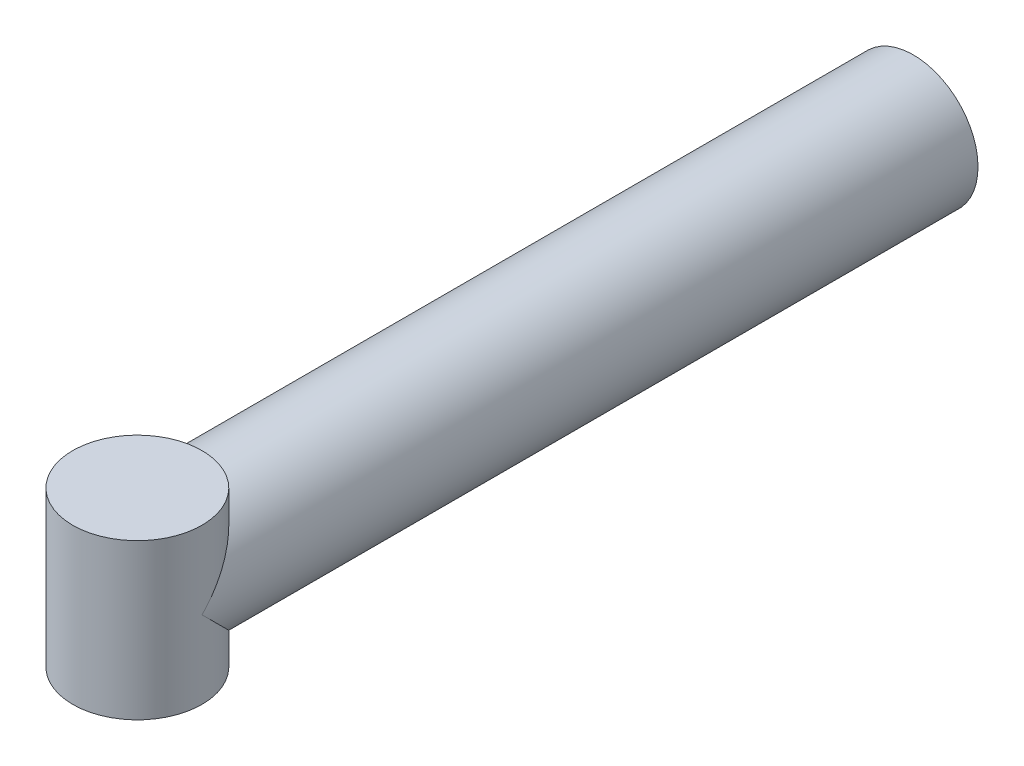
ISO-10303-21;
HEADER;
FILE_DESCRIPTION(('STEP AP214'),'2;1');
FILE_NAME('part.step','',(''),(''),'','','');
FILE_SCHEMA(('AUTOMOTIVE_DESIGN { 1 0 10303 214 1 1 1 1 }'));
ENDSEC;
DATA;
#1=APPLICATION_CONTEXT('core data for automotive mechanical design processes');
#2=APPLICATION_PROTOCOL_DEFINITION('international standard','automotive_design',2000,#1);
#3=PRODUCT_CONTEXT('',#1,'mechanical');
#4=PRODUCT('Part','Part','',(#3));
#5=PRODUCT_RELATED_PRODUCT_CATEGORY('part','',(#4));
#6=PRODUCT_DEFINITION_FORMATION('','',#4);
#7=PRODUCT_DEFINITION_CONTEXT('part definition',#1,'design');
#8=PRODUCT_DEFINITION('design','',#6,#7);
#9=PRODUCT_DEFINITION_SHAPE('','',#8);
#10=(LENGTH_UNIT() NAMED_UNIT(*) SI_UNIT(.MILLI.,.METRE.));
#11=(NAMED_UNIT(*) PLANE_ANGLE_UNIT() SI_UNIT($,.RADIAN.));
#12=(NAMED_UNIT(*) SI_UNIT($,.STERADIAN.) SOLID_ANGLE_UNIT());
#13=UNCERTAINTY_MEASURE_WITH_UNIT(LENGTH_MEASURE(1.E-05),#10,'distance_accuracy_value','');
#14=(GEOMETRIC_REPRESENTATION_CONTEXT(3) GLOBAL_UNCERTAINTY_ASSIGNED_CONTEXT((#13)) GLOBAL_UNIT_ASSIGNED_CONTEXT((#10,
#11,#12)) REPRESENTATION_CONTEXT('',''));
#15=CARTESIAN_POINT('',(0.,0.,0.));
#16=DIRECTION('',(0.,0.,1.));
#17=DIRECTION('',(1.,0.,0.));
#18=AXIS2_PLACEMENT_3D('',#15,#16,#17);
#19=CARTESIAN_POINT('',(0.,0.,75.));
#20=DIRECTION('',(0.,0.,-1.));
#21=DIRECTION('',(-1.,0.,0.));
#22=AXIS2_PLACEMENT_3D('',#19,#20,#21);
#23=CYLINDRICAL_SURFACE('',#22,6.25);
#24=CARTESIAN_POINT('',(0.,0.,0.));
#25=DIRECTION('',(0.,0.,1.));
#26=DIRECTION('',(1.,0.,0.));
#27=AXIS2_PLACEMENT_3D('',#24,#25,#26);
#28=CIRCLE('',#27,6.25);
#29=CARTESIAN_POINT('',(6.25,0.,0.));
#30=VERTEX_POINT('',#29);
#31=EDGE_CURVE('E11',#30,#30,#28,.T.);
#32=ORIENTED_EDGE('',*,*,#31,.T.);
#33=EDGE_LOOP('',(#32));
#34=FACE_BOUND('',#33,.T.);
#35=CARTESIAN_POINT('',(0.,0.,75.));
#36=DIRECTION('',(0.,-0.707106781186547,-0.707106781186547));
#37=DIRECTION('',(0.,0.707106781186547,-0.707106781186547));
#38=AXIS2_PLACEMENT_3D('',#35,#36,#37);
#39=ELLIPSE('',#38,8.83883476483185,6.25);
#40=CARTESIAN_POINT('',(6.25,0.,75.));
#41=VERTEX_POINT('',#40);
#42=CARTESIAN_POINT('',(-6.25,0.,75.));
#43=VERTEX_POINT('',#42);
#44=EDGE_CURVE('E40',#41,#43,#39,.F.);
#45=ORIENTED_EDGE('',*,*,#44,.F.);
#46=CARTESIAN_POINT('',(0.,0.,75.));
#47=DIRECTION('',(0.,0.707106781186547,-0.707106781186547));
#48=DIRECTION('',(0.,-0.707106781186547,-0.707106781186547));
#49=AXIS2_PLACEMENT_3D('',#46,#47,#48);
#50=ELLIPSE('',#49,8.83883476483185,6.25);
#51=EDGE_CURVE('E46',#43,#41,#50,.F.);
#52=ORIENTED_EDGE('',*,*,#51,.F.);
#53=EDGE_LOOP('',(#45,#52));
#54=FACE_BOUND('',#53,.T.);
#55=ADVANCED_FACE('F33',(#34,#54),#23,.T.);
#56=CARTESIAN_POINT('',(0.,0.,0.));
#57=DIRECTION('',(0.,0.,1.));
#58=DIRECTION('',(1.,0.,0.));
#59=AXIS2_PLACEMENT_3D('',#56,#57,#58);
#60=PLANE('',#59);
#61=ORIENTED_EDGE('',*,*,#31,.F.);
#62=EDGE_LOOP('',(#61));
#63=FACE_BOUND('',#62,.T.);
#64=ADVANCED_FACE('F71',(#63),#60,.F.);
#65=CARTESIAN_POINT('',(0.,7.5,75.));
#66=DIRECTION('',(0.,-1.,0.));
#67=DIRECTION('',(0.,0.,-1.));
#68=AXIS2_PLACEMENT_3D('',#65,#66,#67);
#69=CYLINDRICAL_SURFACE('',#68,6.25);
#70=CARTESIAN_POINT('',(0.,7.5,75.));
#71=DIRECTION('',(0.,1.,0.));
#72=DIRECTION('',(0.,0.,1.));
#73=AXIS2_PLACEMENT_3D('',#70,#71,#72);
#74=CIRCLE('',#73,6.25);
#75=CARTESIAN_POINT('',(0.,7.5,81.25));
#76=VERTEX_POINT('',#75);
#77=EDGE_CURVE('E50',#76,#76,#74,.T.);
#78=ORIENTED_EDGE('',*,*,#77,.F.);
#79=EDGE_LOOP('',(#78));
#80=FACE_BOUND('',#79,.T.);
#81=CARTESIAN_POINT('',(0.,-7.5,75.));
#82=DIRECTION('',(0.,1.,0.));
#83=DIRECTION('',(0.,0.,1.));
#84=AXIS2_PLACEMENT_3D('',#81,#82,#83);
#85=CIRCLE('',#84,6.25);
#86=CARTESIAN_POINT('',(0.,-7.5,81.25));
#87=VERTEX_POINT('',#86);
#88=EDGE_CURVE('E53',#87,#87,#85,.T.);
#89=ORIENTED_EDGE('',*,*,#88,.T.);
#90=EDGE_LOOP('',(#89));
#91=FACE_BOUND('',#90,.T.);
#92=ORIENTED_EDGE('',*,*,#51,.T.);
#93=ORIENTED_EDGE('',*,*,#44,.T.);
#94=EDGE_LOOP('',(#92,#93));
#95=FACE_BOUND('',#94,.T.);
#96=ADVANCED_FACE('F49',(#80,#91,#95),#69,.T.);
#97=CARTESIAN_POINT('',(0.,7.5,75.));
#98=DIRECTION('',(0.,1.,0.));
#99=DIRECTION('',(0.,0.,1.));
#100=AXIS2_PLACEMENT_3D('',#97,#98,#99);
#101=PLANE('',#100);
#102=ORIENTED_EDGE('',*,*,#77,.T.);
#103=EDGE_LOOP('',(#102));
#104=FACE_BOUND('',#103,.T.);
#105=ADVANCED_FACE('F62',(#104),#101,.T.);
#106=CARTESIAN_POINT('',(0.,-7.5,75.));
#107=DIRECTION('',(0.,1.,0.));
#108=DIRECTION('',(0.,0.,1.));
#109=AXIS2_PLACEMENT_3D('',#106,#107,#108);
#110=PLANE('',#109);
#111=ORIENTED_EDGE('',*,*,#88,.F.);
#112=EDGE_LOOP('',(#111));
#113=FACE_BOUND('',#112,.T.);
#114=ADVANCED_FACE('F60',(#113),#110,.F.);
#115=CLOSED_SHELL('',(#55,#64,#96,#105,#114));
#116=MANIFOLD_SOLID_BREP('B2',#115);
#117=ADVANCED_BREP_SHAPE_REPRESENTATION('',(#18,#116),#14);
#118=SHAPE_DEFINITION_REPRESENTATION(#9,#117);
ENDSEC;
END-ISO-10303-21;
